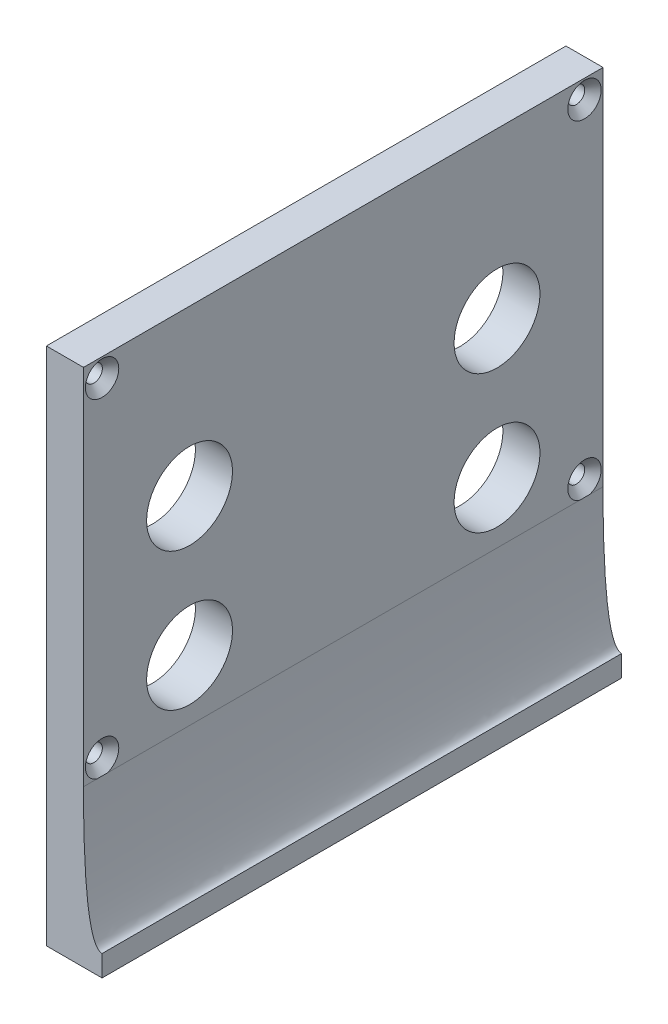
ISO-10303-21;
HEADER;
FILE_DESCRIPTION(('STEP AP214'),'2;1');
FILE_NAME('part.step','',(''),(''),'','','');
FILE_SCHEMA(('AUTOMOTIVE_DESIGN { 1 0 10303 214 1 1 1 1 }'));
ENDSEC;
DATA;
#1=APPLICATION_CONTEXT('core data for automotive mechanical design processes');
#2=APPLICATION_PROTOCOL_DEFINITION('international standard','automotive_design',2000,#1);
#3=PRODUCT_CONTEXT('',#1,'mechanical');
#4=PRODUCT('Part','Part','',(#3));
#5=PRODUCT_RELATED_PRODUCT_CATEGORY('part','',(#4));
#6=PRODUCT_DEFINITION_FORMATION('','',#4);
#7=PRODUCT_DEFINITION_CONTEXT('part definition',#1,'design');
#8=PRODUCT_DEFINITION('design','',#6,#7);
#9=PRODUCT_DEFINITION_SHAPE('','',#8);
#10=(LENGTH_UNIT() NAMED_UNIT(*) SI_UNIT(.MILLI.,.METRE.));
#11=(NAMED_UNIT(*) PLANE_ANGLE_UNIT() SI_UNIT($,.RADIAN.));
#12=(NAMED_UNIT(*) SI_UNIT($,.STERADIAN.) SOLID_ANGLE_UNIT());
#13=UNCERTAINTY_MEASURE_WITH_UNIT(LENGTH_MEASURE(1.E-05),#10,'distance_accuracy_value','');
#14=(GEOMETRIC_REPRESENTATION_CONTEXT(3) GLOBAL_UNCERTAINTY_ASSIGNED_CONTEXT((#13)) GLOBAL_UNIT_ASSIGNED_CONTEXT((#10,
#11,#12)) REPRESENTATION_CONTEXT('',''));
#15=CARTESIAN_POINT('',(0.,0.,0.));
#16=DIRECTION('',(0.,0.,1.));
#17=DIRECTION('',(1.,0.,0.));
#18=AXIS2_PLACEMENT_3D('',#15,#16,#17);
#19=CARTESIAN_POINT('',(-46.838690811529,41.5674555111962,98.));
#20=DIRECTION('',(0.,-1.,0.));
#21=DIRECTION('',(0.,0.,-1.));
#22=AXIS2_PLACEMENT_3D('',#19,#20,#21);
#23=PLANE('',#22);
#24=DIRECTION('',(-1.,0.,0.));
#25=VECTOR('',#24,1.);
#26=CARTESIAN_POINT('',(-46.838690811529,41.5674555111962,0.));
#27=LINE('',#26,#25);
#28=CARTESIAN_POINT('',(-39.838690811529,41.5674555111962,0.));
#29=VERTEX_POINT('',#28);
#30=CARTESIAN_POINT('',(-46.838690811529,41.5674555111962,0.));
#31=VERTEX_POINT('',#30);
#32=EDGE_CURVE('E288',#29,#31,#27,.T.);
#33=ORIENTED_EDGE('',*,*,#32,.T.);
#34=DIRECTION('',(0.,0.,-1.));
#35=VECTOR('',#34,1.);
#36=CARTESIAN_POINT('',(-46.838690811529,41.5674555111962,98.));
#37=LINE('',#36,#35);
#38=CARTESIAN_POINT('',(-46.838690811529,41.5674555111962,98.));
#39=VERTEX_POINT('',#38);
#40=EDGE_CURVE('E13',#39,#31,#37,.T.);
#41=ORIENTED_EDGE('',*,*,#40,.F.);
#42=DIRECTION('',(-1.,0.,0.));
#43=VECTOR('',#42,1.);
#44=CARTESIAN_POINT('',(-46.838690811529,41.5674555111962,98.));
#45=LINE('',#44,#43);
#46=CARTESIAN_POINT('',(-39.838690811529,41.5674555111962,98.));
#47=VERTEX_POINT('',#46);
#48=EDGE_CURVE('E214',#47,#39,#45,.T.);
#49=ORIENTED_EDGE('',*,*,#48,.F.);
#50=DIRECTION('',(0.,0.,-1.));
#51=VECTOR('',#50,1.);
#52=CARTESIAN_POINT('',(-39.838690811529,41.5674555111962,98.));
#53=LINE('',#52,#51);
#54=EDGE_CURVE('E310',#47,#29,#53,.T.);
#55=ORIENTED_EDGE('',*,*,#54,.T.);
#56=EDGE_LOOP('',(#33,#41,#49,#55));
#57=FACE_BOUND('',#56,.T.);
#58=ADVANCED_FACE('F46',(#57),#23,.F.);
#59=CARTESIAN_POINT('',(-46.838690811529,41.5674555111962,98.));
#60=DIRECTION('',(1.,0.,0.));
#61=DIRECTION('',(0.,0.,-1.));
#62=AXIS2_PLACEMENT_3D('',#59,#60,#61);
#63=PLANE('',#62);
#64=DIRECTION('',(0.,0.,1.));
#65=VECTOR('',#64,1.);
#66=CARTESIAN_POINT('',(-46.838690811529,33.0674555111962,39.5));
#67=LINE('',#66,#65);
#68=CARTESIAN_POINT('',(-46.838690811529,33.0674555111962,39.5));
#69=VERTEX_POINT('',#68);
#70=CARTESIAN_POINT('',(-46.838690811529,33.0674555111962,69.));
#71=VERTEX_POINT('',#70);
#72=EDGE_CURVE('E165',#69,#71,#67,.T.);
#73=ORIENTED_EDGE('',*,*,#72,.F.);
#74=DIRECTION('',(0.,-1.,0.));
#75=VECTOR('',#74,1.);
#76=CARTESIAN_POINT('',(-46.838690811529,40.0674555111962,39.5));
#77=LINE('',#76,#75);
#78=CARTESIAN_POINT('',(-46.838690811529,40.0674555111962,39.5));
#79=VERTEX_POINT('',#78);
#80=EDGE_CURVE('E62',#79,#69,#77,.T.);
#81=ORIENTED_EDGE('',*,*,#80,.F.);
#82=DIRECTION('',(0.,0.,-1.));
#83=VECTOR('',#82,1.);
#84=CARTESIAN_POINT('',(-46.838690811529,40.0674555111962,39.5));
#85=LINE('',#84,#83);
#86=CARTESIAN_POINT('',(-46.838690811529,40.0674555111962,69.));
#87=VERTEX_POINT('',#86);
#88=EDGE_CURVE('E156',#87,#79,#85,.T.);
#89=ORIENTED_EDGE('',*,*,#88,.F.);
#90=DIRECTION('',(0.,1.,0.));
#91=VECTOR('',#90,1.);
#92=CARTESIAN_POINT('',(-46.838690811529,40.0674555111962,69.));
#93=LINE('',#92,#91);
#94=EDGE_CURVE('E159',#71,#87,#93,.T.);
#95=ORIENTED_EDGE('',*,*,#94,.F.);
#96=EDGE_LOOP('',(#73,#81,#89,#95));
#97=FACE_BOUND('',#96,.T.);
#98=CARTESIAN_POINT('',(-46.838690811529,38.0674555111962,94.5));
#99=DIRECTION('',(1.,0.,0.));
#100=DIRECTION('',(0.,0.,-1.));
#101=AXIS2_PLACEMENT_3D('',#98,#99,#100);
#102=CIRCLE('',#101,1.59999999999999);
#103=CARTESIAN_POINT('',(-46.838690811529,38.0674555111962,92.9));
#104=VERTEX_POINT('',#103);
#105=EDGE_CURVE('E49',#104,#104,#102,.T.);
#106=ORIENTED_EDGE('',*,*,#105,.T.);
#107=EDGE_LOOP('',(#106));
#108=FACE_BOUND('',#107,.T.);
#109=CARTESIAN_POINT('',(-46.838690811529,-23.9325444888039,94.5));
#110=DIRECTION('',(1.,0.,0.));
#111=DIRECTION('',(0.,0.,-1.));
#112=AXIS2_PLACEMENT_3D('',#109,#110,#111);
#113=CIRCLE('',#112,1.59999999999999);
#114=CARTESIAN_POINT('',(-46.838690811529,-23.9325444888039,92.9));
#115=VERTEX_POINT('',#114);
#116=EDGE_CURVE('E185',#115,#115,#113,.T.);
#117=ORIENTED_EDGE('',*,*,#116,.T.);
#118=EDGE_LOOP('',(#117));
#119=FACE_BOUND('',#118,.T.);
#120=CARTESIAN_POINT('',(-46.838690811529,-23.9325444888039,3.50000000000002));
#121=DIRECTION('',(1.,0.,0.));
#122=DIRECTION('',(0.,0.,-1.));
#123=AXIS2_PLACEMENT_3D('',#120,#121,#122);
#124=CIRCLE('',#123,1.59999999999999);
#125=CARTESIAN_POINT('',(-46.838690811529,-23.9325444888039,1.90000000000003));
#126=VERTEX_POINT('',#125);
#127=EDGE_CURVE('E193',#126,#126,#124,.T.);
#128=ORIENTED_EDGE('',*,*,#127,.T.);
#129=EDGE_LOOP('',(#128));
#130=FACE_BOUND('',#129,.T.);
#131=CARTESIAN_POINT('',(-46.838690811529,38.0674555111962,3.50000000000002));
#132=DIRECTION('',(1.,0.,0.));
#133=DIRECTION('',(0.,0.,-1.));
#134=AXIS2_PLACEMENT_3D('',#131,#132,#133);
#135=CIRCLE('',#134,1.59999999999999);
#136=CARTESIAN_POINT('',(-46.838690811529,38.0674555111962,1.90000000000003));
#137=VERTEX_POINT('',#136);
#138=EDGE_CURVE('E200',#137,#137,#135,.T.);
#139=ORIENTED_EDGE('',*,*,#138,.T.);
#140=EDGE_LOOP('',(#139));
#141=FACE_BOUND('',#140,.T.);
#142=CARTESIAN_POINT('',(-46.838690811529,-15.4325444888038,20.));
#143=DIRECTION('',(-1.,0.,0.));
#144=DIRECTION('',(0.,0.,1.));
#145=AXIS2_PLACEMENT_3D('',#142,#143,#144);
#146=CIRCLE('',#145,8.09999999999999);
#147=CARTESIAN_POINT('',(-46.838690811529,-15.4325444888038,28.1));
#148=VERTEX_POINT('',#147);
#149=EDGE_CURVE('E208',#148,#148,#146,.T.);
#150=ORIENTED_EDGE('',*,*,#149,.F.);
#151=EDGE_LOOP('',(#150));
#152=FACE_BOUND('',#151,.T.);
#153=CARTESIAN_POINT('',(-46.838690811529,10.5674555111962,78.));
#154=DIRECTION('',(-1.,0.,0.));
#155=DIRECTION('',(0.,0.,1.));
#156=AXIS2_PLACEMENT_3D('',#153,#154,#155);
#157=CIRCLE('',#156,8.09999999999999);
#158=CARTESIAN_POINT('',(-46.838690811529,10.5674555111962,86.1));
#159=VERTEX_POINT('',#158);
#160=EDGE_CURVE('E205',#159,#159,#157,.T.);
#161=ORIENTED_EDGE('',*,*,#160,.F.);
#162=EDGE_LOOP('',(#161));
#163=FACE_BOUND('',#162,.T.);
#164=CARTESIAN_POINT('',(-46.838690811529,-15.4325444888038,78.));
#165=DIRECTION('',(-1.,0.,0.));
#166=DIRECTION('',(0.,0.,1.));
#167=AXIS2_PLACEMENT_3D('',#164,#165,#166);
#168=CIRCLE('',#167,8.10000000000001);
#169=CARTESIAN_POINT('',(-46.838690811529,-15.4325444888038,86.1));
#170=VERTEX_POINT('',#169);
#171=EDGE_CURVE('E201',#170,#170,#168,.T.);
#172=ORIENTED_EDGE('',*,*,#171,.F.);
#173=EDGE_LOOP('',(#172));
#174=FACE_BOUND('',#173,.T.);
#175=CARTESIAN_POINT('',(-46.838690811529,10.5674555111962,20.));
#176=DIRECTION('',(-1.,0.,0.));
#177=DIRECTION('',(0.,0.,1.));
#178=AXIS2_PLACEMENT_3D('',#175,#176,#177);
#179=CIRCLE('',#178,8.1);
#180=CARTESIAN_POINT('',(-46.838690811529,10.5674555111962,28.1));
#181=VERTEX_POINT('',#180);
#182=EDGE_CURVE('E204',#181,#181,#179,.T.);
#183=ORIENTED_EDGE('',*,*,#182,.F.);
#184=EDGE_LOOP('',(#183));
#185=FACE_BOUND('',#184,.T.);
#186=DIRECTION('',(0.,-1.,0.));
#187=VECTOR('',#186,1.);
#188=CARTESIAN_POINT('',(-46.838690811529,41.5674555111962,0.));
#189=LINE('',#188,#187);
#190=CARTESIAN_POINT('',(-46.838690811529,-56.4325444888039,0.));
#191=VERTEX_POINT('',#190);
#192=EDGE_CURVE('E279',#31,#191,#189,.T.);
#193=ORIENTED_EDGE('',*,*,#192,.T.);
#194=DIRECTION('',(0.,0.,-1.));
#195=VECTOR('',#194,1.);
#196=CARTESIAN_POINT('',(-46.838690811529,-56.4325444888039,98.));
#197=LINE('',#196,#195);
#198=CARTESIAN_POINT('',(-46.838690811529,-56.4325444888039,98.));
#199=VERTEX_POINT('',#198);
#200=EDGE_CURVE('E54',#199,#191,#197,.T.);
#201=ORIENTED_EDGE('',*,*,#200,.F.);
#202=DIRECTION('',(0.,-1.,0.));
#203=VECTOR('',#202,1.);
#204=CARTESIAN_POINT('',(-46.838690811529,41.5674555111962,98.));
#205=LINE('',#204,#203);
#206=EDGE_CURVE('E217',#39,#199,#205,.T.);
#207=ORIENTED_EDGE('',*,*,#206,.F.);
#208=ORIENTED_EDGE('',*,*,#40,.T.);
#209=EDGE_LOOP('',(#193,#201,#207,#208));
#210=FACE_BOUND('',#209,.T.);
#211=ADVANCED_FACE('F248',(#97,#108,#119,#130,#141,#152,#163,#174,#185,#210),#63,.F.);
#212=CARTESIAN_POINT('',(-46.838690811529,-56.4325444888039,98.));
#213=DIRECTION('',(0.,1.,0.));
#214=DIRECTION('',(0.,0.,1.));
#215=AXIS2_PLACEMENT_3D('',#212,#213,#214);
#216=PLANE('',#215);
#217=DIRECTION('',(1.,0.,0.));
#218=VECTOR('',#217,1.);
#219=CARTESIAN_POINT('',(-46.838690811529,-56.4325444888039,0.));
#220=LINE('',#219,#218);
#221=CARTESIAN_POINT('',(-36.338690811529,-56.4325444888039,0.));
#222=VERTEX_POINT('',#221);
#223=EDGE_CURVE('E287',#191,#222,#220,.T.);
#224=ORIENTED_EDGE('',*,*,#223,.T.);
#225=DIRECTION('',(0.,0.,-1.));
#226=VECTOR('',#225,1.);
#227=CARTESIAN_POINT('',(-36.338690811529,-56.4325444888039,98.));
#228=LINE('',#227,#226);
#229=CARTESIAN_POINT('',(-36.338690811529,-56.4325444888039,98.));
#230=VERTEX_POINT('',#229);
#231=EDGE_CURVE('E292',#230,#222,#228,.T.);
#232=ORIENTED_EDGE('',*,*,#231,.F.);
#233=DIRECTION('',(1.,0.,0.));
#234=VECTOR('',#233,1.);
#235=CARTESIAN_POINT('',(-46.838690811529,-56.4325444888039,98.));
#236=LINE('',#235,#234);
#237=EDGE_CURVE('E220',#199,#230,#236,.T.);
#238=ORIENTED_EDGE('',*,*,#237,.F.);
#239=ORIENTED_EDGE('',*,*,#200,.T.);
#240=EDGE_LOOP('',(#224,#232,#238,#239));
#241=FACE_BOUND('',#240,.T.);
#242=ADVANCED_FACE('F245',(#241),#216,.F.);
#243=CARTESIAN_POINT('',(-36.338690811529,-56.4325444888039,98.));
#244=DIRECTION('',(-1.,0.,0.));
#245=DIRECTION('',(0.,0.,1.));
#246=AXIS2_PLACEMENT_3D('',#243,#244,#245);
#247=PLANE('',#246);
#248=DIRECTION('',(0.,1.,0.));
#249=VECTOR('',#248,1.);
#250=CARTESIAN_POINT('',(-36.338690811529,-56.4325444888039,0.));
#251=LINE('',#250,#249);
#252=CARTESIAN_POINT('',(-36.338690811529,-52.4325444888039,0.));
#253=VERTEX_POINT('',#252);
#254=EDGE_CURVE('E297',#222,#253,#251,.T.);
#255=ORIENTED_EDGE('',*,*,#254,.T.);
#256=DIRECTION('',(0.,0.,-1.));
#257=VECTOR('',#256,1.);
#258=CARTESIAN_POINT('',(-36.338690811529,-52.4325444888039,98.));
#259=LINE('',#258,#257);
#260=CARTESIAN_POINT('',(-36.338690811529,-52.4325444888039,98.));
#261=VERTEX_POINT('',#260);
#262=EDGE_CURVE('E317',#261,#253,#259,.T.);
#263=ORIENTED_EDGE('',*,*,#262,.F.);
#264=DIRECTION('',(0.,1.,0.));
#265=VECTOR('',#264,1.);
#266=CARTESIAN_POINT('',(-36.338690811529,-56.4325444888039,98.));
#267=LINE('',#266,#265);
#268=EDGE_CURVE('E222',#230,#261,#267,.T.);
#269=ORIENTED_EDGE('',*,*,#268,.F.);
#270=ORIENTED_EDGE('',*,*,#231,.T.);
#271=EDGE_LOOP('',(#255,#263,#269,#270));
#272=FACE_BOUND('',#271,.T.);
#273=ADVANCED_FACE('F240',(#272),#247,.F.);
#274=CARTESIAN_POINT('',(-36.338690811529,-52.4325444888039,98.));
#275=CARTESIAN_POINT('',(-39.838690811529,-52.4325444888039,98.));
#276=CARTESIAN_POINT('',(-39.838690811529,-26.9325444888039,98.));
#277=B_SPLINE_CURVE_WITH_KNOTS('',2,(#274,#275,#276),.UNSPECIFIED.,.F.,.F.,(3,3),(0.,1.),.UNSPECIFIED.);
#278=DIRECTION('',(0.,0.,-1.));
#279=VECTOR('',#278,1.);
#280=SURFACE_OF_LINEAR_EXTRUSION('',#277,#279);
#281=CARTESIAN_POINT('',(-36.338690811529,-52.4325444888039,0.));
#282=CARTESIAN_POINT('',(-39.838690811529,-52.4325444888039,0.));
#283=CARTESIAN_POINT('',(-39.838690811529,-26.9325444888039,0.));
#284=B_SPLINE_CURVE_WITH_KNOTS('',2,(#281,#282,#283),.UNSPECIFIED.,.F.,.F.,(3,3),(0.,1.),.UNSPECIFIED.);
#285=CARTESIAN_POINT('',(-39.838690811529,-26.9325444888039,0.));
#286=VERTEX_POINT('',#285);
#287=EDGE_CURVE('E299',#253,#286,#284,.T.);
#288=ORIENTED_EDGE('',*,*,#287,.T.);
#289=DIRECTION('',(0.,0.,-1.));
#290=VECTOR('',#289,1.);
#291=CARTESIAN_POINT('',(-39.838690811529,-26.9325444888039,98.));
#292=LINE('',#291,#290);
#293=CARTESIAN_POINT('',(-39.838690811529,-26.9325444888039,2.5395313643851));
#294=VERTEX_POINT('',#293);
#295=EDGE_CURVE('E313',#294,#286,#292,.T.);
#296=ORIENTED_EDGE('',*,*,#295,.F.);
#297=CARTESIAN_POINT('',(-39.838690811529,-26.9325444888039,4.46046863561494));
#298=VERTEX_POINT('',#297);
#299=EDGE_CURVE('E320',#298,#294,#292,.T.);
#300=ORIENTED_EDGE('',*,*,#299,.F.);
#301=CARTESIAN_POINT('',(-39.838690811529,-26.9325444888039,93.5395313643851));
#302=VERTEX_POINT('',#301);
#303=EDGE_CURVE('E319',#302,#298,#292,.T.);
#304=ORIENTED_EDGE('',*,*,#303,.F.);
#305=CARTESIAN_POINT('',(-39.838690811529,-26.9325444888039,95.4604686356149));
#306=VERTEX_POINT('',#305);
#307=EDGE_CURVE('E318',#306,#302,#292,.T.);
#308=ORIENTED_EDGE('',*,*,#307,.F.);
#309=CARTESIAN_POINT('',(-39.838690811529,-26.9325444888039,98.));
#310=VERTEX_POINT('',#309);
#311=EDGE_CURVE('E314',#310,#306,#292,.T.);
#312=ORIENTED_EDGE('',*,*,#311,.F.);
#313=EDGE_CURVE('E224',#261,#310,#277,.T.);
#314=ORIENTED_EDGE('',*,*,#313,.F.);
#315=ORIENTED_EDGE('',*,*,#262,.T.);
#316=EDGE_LOOP('',(#288,#296,#300,#304,#308,#312,#314,#315));
#317=FACE_BOUND('',#316,.T.);
#318=ADVANCED_FACE('F235',(#317),#280,.F.);
#319=CARTESIAN_POINT('',(-39.838690811529,41.5674555111962,98.));
#320=DIRECTION('',(-1.,0.,0.));
#321=DIRECTION('',(0.,0.,1.));
#322=AXIS2_PLACEMENT_3D('',#319,#320,#321);
#323=PLANE('',#322);
#324=CARTESIAN_POINT('',(-39.838690811529,38.0674555111962,94.5));
#325=DIRECTION('',(1.,0.,0.));
#326=DIRECTION('',(0.,0.,-1.));
#327=AXIS2_PLACEMENT_3D('',#324,#325,#326);
#328=CIRCLE('',#327,3.15);
#329=CARTESIAN_POINT('',(-39.838690811529,38.0674555111962,91.35));
#330=VERTEX_POINT('',#329);
#331=EDGE_CURVE('E171',#330,#330,#328,.T.);
#332=ORIENTED_EDGE('',*,*,#331,.F.);
#333=EDGE_LOOP('',(#332));
#334=FACE_BOUND('',#333,.T.);
#335=CARTESIAN_POINT('',(-39.838690811529,38.0674555111962,3.50000000000002));
#336=DIRECTION('',(1.,0.,0.));
#337=DIRECTION('',(0.,0.,-1.));
#338=AXIS2_PLACEMENT_3D('',#335,#336,#337);
#339=CIRCLE('',#338,3.15);
#340=CARTESIAN_POINT('',(-39.838690811529,38.0674555111962,0.350000000000017));
#341=VERTEX_POINT('',#340);
#342=EDGE_CURVE('E194',#341,#341,#339,.T.);
#343=ORIENTED_EDGE('',*,*,#342,.F.);
#344=EDGE_LOOP('',(#343));
#345=FACE_BOUND('',#344,.T.);
#346=CARTESIAN_POINT('',(-39.838690811529,-15.4325444888038,20.));
#347=DIRECTION('',(-1.,0.,0.));
#348=DIRECTION('',(0.,0.,1.));
#349=AXIS2_PLACEMENT_3D('',#346,#347,#348);
#350=CIRCLE('',#349,8.09999999999999);
#351=CARTESIAN_POINT('',(-39.838690811529,-15.4325444888038,28.1));
#352=VERTEX_POINT('',#351);
#353=EDGE_CURVE('E332',#352,#352,#350,.T.);
#354=ORIENTED_EDGE('',*,*,#353,.T.);
#355=EDGE_LOOP('',(#354));
#356=FACE_BOUND('',#355,.T.);
#357=CARTESIAN_POINT('',(-39.838690811529,10.5674555111962,78.));
#358=DIRECTION('',(-1.,0.,0.));
#359=DIRECTION('',(0.,0.,1.));
#360=AXIS2_PLACEMENT_3D('',#357,#358,#359);
#361=CIRCLE('',#360,8.09999999999999);
#362=CARTESIAN_POINT('',(-39.838690811529,10.5674555111962,86.1));
#363=VERTEX_POINT('',#362);
#364=EDGE_CURVE('E329',#363,#363,#361,.T.);
#365=ORIENTED_EDGE('',*,*,#364,.T.);
#366=EDGE_LOOP('',(#365));
#367=FACE_BOUND('',#366,.T.);
#368=CARTESIAN_POINT('',(-39.838690811529,-15.4325444888038,78.));
#369=DIRECTION('',(-1.,0.,0.));
#370=DIRECTION('',(0.,0.,1.));
#371=AXIS2_PLACEMENT_3D('',#368,#369,#370);
#372=CIRCLE('',#371,8.10000000000001);
#373=CARTESIAN_POINT('',(-39.838690811529,-15.4325444888038,86.1));
#374=VERTEX_POINT('',#373);
#375=EDGE_CURVE('E326',#374,#374,#372,.T.);
#376=ORIENTED_EDGE('',*,*,#375,.T.);
#377=EDGE_LOOP('',(#376));
#378=FACE_BOUND('',#377,.T.);
#379=CARTESIAN_POINT('',(-39.838690811529,10.5674555111962,20.));
#380=DIRECTION('',(-1.,0.,0.));
#381=DIRECTION('',(0.,0.,1.));
#382=AXIS2_PLACEMENT_3D('',#379,#380,#381);
#383=CIRCLE('',#382,8.1);
#384=CARTESIAN_POINT('',(-39.838690811529,10.5674555111962,28.1));
#385=VERTEX_POINT('',#384);
#386=EDGE_CURVE('E213',#385,#385,#383,.T.);
#387=ORIENTED_EDGE('',*,*,#386,.T.);
#388=EDGE_LOOP('',(#387));
#389=FACE_BOUND('',#388,.T.);
#390=ORIENTED_EDGE('',*,*,#311,.T.);
#391=CARTESIAN_POINT('',(-39.838690811529,-23.9325444888039,94.5));
#392=DIRECTION('',(1.,0.,0.));
#393=DIRECTION('',(0.,0.,-1.));
#394=AXIS2_PLACEMENT_3D('',#391,#392,#393);
#395=CIRCLE('',#394,3.15);
#396=EDGE_CURVE('E182',#302,#306,#395,.T.);
#397=ORIENTED_EDGE('',*,*,#396,.F.);
#398=ORIENTED_EDGE('',*,*,#303,.T.);
#399=CARTESIAN_POINT('',(-39.838690811529,-23.9325444888039,3.50000000000002));
#400=DIRECTION('',(1.,0.,0.));
#401=DIRECTION('',(0.,0.,-1.));
#402=AXIS2_PLACEMENT_3D('',#399,#400,#401);
#403=CIRCLE('',#402,3.15);
#404=EDGE_CURVE('E190',#294,#298,#403,.T.);
#405=ORIENTED_EDGE('',*,*,#404,.F.);
#406=ORIENTED_EDGE('',*,*,#295,.T.);
#407=DIRECTION('',(0.,1.,0.));
#408=VECTOR('',#407,1.);
#409=CARTESIAN_POINT('',(-39.838690811529,41.5674555111962,0.));
#410=LINE('',#409,#408);
#411=EDGE_CURVE('E218',#286,#29,#410,.T.);
#412=ORIENTED_EDGE('',*,*,#411,.T.);
#413=ORIENTED_EDGE('',*,*,#54,.F.);
#414=DIRECTION('',(0.,1.,0.));
#415=VECTOR('',#414,1.);
#416=CARTESIAN_POINT('',(-39.838690811529,41.5674555111962,98.));
#417=LINE('',#416,#415);
#418=EDGE_CURVE('E229',#310,#47,#417,.T.);
#419=ORIENTED_EDGE('',*,*,#418,.F.);
#420=EDGE_LOOP('',(#390,#397,#398,#405,#406,#412,#413,#419));
#421=FACE_BOUND('',#420,.T.);
#422=ADVANCED_FACE('F239',(#334,#345,#356,#367,#378,#389,#421),#323,.F.);
#423=CARTESIAN_POINT('',(-38.963690811529,-46.0575444888039,98.));
#424=DIRECTION('',(0.,0.,-1.));
#425=DIRECTION('',(-1.,0.,0.));
#426=AXIS2_PLACEMENT_3D('',#423,#424,#425);
#427=PLANE('',#426);
#428=ORIENTED_EDGE('',*,*,#48,.T.);
#429=ORIENTED_EDGE('',*,*,#206,.T.);
#430=ORIENTED_EDGE('',*,*,#237,.T.);
#431=ORIENTED_EDGE('',*,*,#268,.T.);
#432=ORIENTED_EDGE('',*,*,#313,.T.);
#433=ORIENTED_EDGE('',*,*,#418,.T.);
#434=EDGE_LOOP('',(#428,#429,#430,#431,#432,#433));
#435=FACE_BOUND('',#434,.T.);
#436=ADVANCED_FACE('F357',(#435),#427,.F.);
#437=CARTESIAN_POINT('',(-38.963690811529,-46.0575444888039,0.));
#438=DIRECTION('',(0.,0.,-1.));
#439=DIRECTION('',(-1.,0.,0.));
#440=AXIS2_PLACEMENT_3D('',#437,#438,#439);
#441=PLANE('',#440);
#442=ORIENTED_EDGE('',*,*,#32,.F.);
#443=ORIENTED_EDGE('',*,*,#411,.F.);
#444=ORIENTED_EDGE('',*,*,#287,.F.);
#445=ORIENTED_EDGE('',*,*,#254,.F.);
#446=ORIENTED_EDGE('',*,*,#223,.F.);
#447=ORIENTED_EDGE('',*,*,#192,.F.);
#448=EDGE_LOOP('',(#442,#443,#444,#445,#446,#447));
#449=FACE_BOUND('',#448,.T.);
#450=ADVANCED_FACE('F295',(#449),#441,.T.);
#451=CARTESIAN_POINT('',(-36.338690811529,10.5674555111962,20.));
#452=DIRECTION('',(-1.,0.,0.));
#453=DIRECTION('',(0.,0.,1.));
#454=AXIS2_PLACEMENT_3D('',#451,#452,#453);
#455=CYLINDRICAL_SURFACE('',#454,8.1);
#456=ORIENTED_EDGE('',*,*,#182,.T.);
#457=EDGE_LOOP('',(#456));
#458=FACE_BOUND('',#457,.T.);
#459=ORIENTED_EDGE('',*,*,#386,.F.);
#460=EDGE_LOOP('',(#459));
#461=FACE_BOUND('',#460,.T.);
#462=ADVANCED_FACE('F367',(#458,#461),#455,.F.);
#463=CARTESIAN_POINT('',(-36.338690811529,-15.4325444888038,78.));
#464=DIRECTION('',(-1.,0.,0.));
#465=DIRECTION('',(0.,0.,1.));
#466=AXIS2_PLACEMENT_3D('',#463,#464,#465);
#467=CYLINDRICAL_SURFACE('',#466,8.10000000000001);
#468=ORIENTED_EDGE('',*,*,#171,.T.);
#469=EDGE_LOOP('',(#468));
#470=FACE_BOUND('',#469,.T.);
#471=ORIENTED_EDGE('',*,*,#375,.F.);
#472=EDGE_LOOP('',(#471));
#473=FACE_BOUND('',#472,.T.);
#474=ADVANCED_FACE('F372',(#470,#473),#467,.F.);
#475=CARTESIAN_POINT('',(-36.338690811529,10.5674555111962,78.));
#476=DIRECTION('',(-1.,0.,0.));
#477=DIRECTION('',(0.,0.,1.));
#478=AXIS2_PLACEMENT_3D('',#475,#476,#477);
#479=CYLINDRICAL_SURFACE('',#478,8.09999999999999);
#480=ORIENTED_EDGE('',*,*,#160,.T.);
#481=EDGE_LOOP('',(#480));
#482=FACE_BOUND('',#481,.T.);
#483=ORIENTED_EDGE('',*,*,#364,.F.);
#484=EDGE_LOOP('',(#483));
#485=FACE_BOUND('',#484,.T.);
#486=ADVANCED_FACE('F378',(#482,#485),#479,.F.);
#487=CARTESIAN_POINT('',(-36.338690811529,-15.4325444888038,20.));
#488=DIRECTION('',(-1.,0.,0.));
#489=DIRECTION('',(0.,0.,1.));
#490=AXIS2_PLACEMENT_3D('',#487,#488,#489);
#491=CYLINDRICAL_SURFACE('',#490,8.09999999999999);
#492=ORIENTED_EDGE('',*,*,#149,.T.);
#493=EDGE_LOOP('',(#492));
#494=FACE_BOUND('',#493,.T.);
#495=ORIENTED_EDGE('',*,*,#353,.F.);
#496=EDGE_LOOP('',(#495));
#497=FACE_BOUND('',#496,.T.);
#498=ADVANCED_FACE('F374',(#494,#497),#491,.F.);
#499=CARTESIAN_POINT('',(-39.838690811529,38.0674555111962,3.50000000000002));
#500=DIRECTION('',(1.,0.,0.));
#501=DIRECTION('',(0.,0.,-1.));
#502=AXIS2_PLACEMENT_3D('',#499,#500,#501);
#503=CYLINDRICAL_SURFACE('',#502,1.59999999999999);
#504=CARTESIAN_POINT('',(-41.388690811529,38.0674555111962,3.50000000000002));
#505=DIRECTION('',(1.,0.,0.));
#506=DIRECTION('',(0.,0.,-1.));
#507=AXIS2_PLACEMENT_3D('',#504,#505,#506);
#508=CIRCLE('',#507,1.59999999999999);
#509=CARTESIAN_POINT('',(-41.388690811529,38.0674555111962,1.90000000000003));
#510=VERTEX_POINT('',#509);
#511=EDGE_CURVE('E197',#510,#510,#508,.T.);
#512=ORIENTED_EDGE('',*,*,#511,.T.);
#513=EDGE_LOOP('',(#512));
#514=FACE_BOUND('',#513,.T.);
#515=ORIENTED_EDGE('',*,*,#138,.F.);
#516=EDGE_LOOP('',(#515));
#517=FACE_BOUND('',#516,.T.);
#518=ADVANCED_FACE('F377',(#514,#517),#503,.F.);
#519=CARTESIAN_POINT('',(-39.838690811529,38.0674555111962,3.50000000000002));
#520=DIRECTION('',(1.,0.,0.));
#521=DIRECTION('',(0.,0.,-1.));
#522=AXIS2_PLACEMENT_3D('',#519,#520,#521);
#523=CONICAL_SURFACE('',#522,3.15,0.785398163397453);
#524=ORIENTED_EDGE('',*,*,#511,.F.);
#525=EDGE_LOOP('',(#524));
#526=FACE_BOUND('',#525,.T.);
#527=ORIENTED_EDGE('',*,*,#342,.T.);
#528=EDGE_LOOP('',(#527));
#529=FACE_BOUND('',#528,.T.);
#530=ADVANCED_FACE('F388',(#526,#529),#523,.F.);
#531=CARTESIAN_POINT('',(-39.838690811529,-23.9325444888039,3.50000000000002));
#532=DIRECTION('',(1.,0.,0.));
#533=DIRECTION('',(0.,0.,-1.));
#534=AXIS2_PLACEMENT_3D('',#531,#532,#533);
#535=CYLINDRICAL_SURFACE('',#534,1.59999999999999);
#536=CARTESIAN_POINT('',(-41.388690811529,-23.9325444888039,3.50000000000002));
#537=DIRECTION('',(1.,0.,0.));
#538=DIRECTION('',(0.,0.,-1.));
#539=AXIS2_PLACEMENT_3D('',#536,#537,#538);
#540=CIRCLE('',#539,1.59999999999999);
#541=CARTESIAN_POINT('',(-41.388690811529,-23.9325444888039,1.90000000000003));
#542=VERTEX_POINT('',#541);
#543=EDGE_CURVE('E189',#542,#542,#540,.T.);
#544=ORIENTED_EDGE('',*,*,#543,.T.);
#545=EDGE_LOOP('',(#544));
#546=FACE_BOUND('',#545,.T.);
#547=ORIENTED_EDGE('',*,*,#127,.F.);
#548=EDGE_LOOP('',(#547));
#549=FACE_BOUND('',#548,.T.);
#550=ADVANCED_FACE('F392',(#546,#549),#535,.F.);
#551=CARTESIAN_POINT('',(-39.838690811529,-20.7825444888039,3.50000000000002));
#552=DIRECTION('',(1.,0.,0.));
#553=DIRECTION('',(0.,0.,-1.));
#554=AXIS2_PLACEMENT_3D('',#551,#552,#553);
#555=PLANE('',#554);
#556=ORIENTED_EDGE('',*,*,#299,.T.);
#557=EDGE_CURVE('E186',#298,#294,#403,.T.);
#558=ORIENTED_EDGE('',*,*,#557,.F.);
#559=EDGE_LOOP('',(#556,#558));
#560=FACE_BOUND('',#559,.T.);
#561=ADVANCED_FACE('F394',(#560),#555,.F.);
#562=CARTESIAN_POINT('',(-39.838690811529,-23.9325444888039,3.50000000000002));
#563=DIRECTION('',(1.,0.,0.));
#564=DIRECTION('',(0.,0.,-1.));
#565=AXIS2_PLACEMENT_3D('',#562,#563,#564);
#566=CONICAL_SURFACE('',#565,3.15,0.785398163397453);
#567=ORIENTED_EDGE('',*,*,#543,.F.);
#568=EDGE_LOOP('',(#567));
#569=FACE_BOUND('',#568,.T.);
#570=ORIENTED_EDGE('',*,*,#557,.T.);
#571=ORIENTED_EDGE('',*,*,#404,.T.);
#572=EDGE_LOOP('',(#570,#571));
#573=FACE_BOUND('',#572,.T.);
#574=ADVANCED_FACE('F340',(#569,#573),#566,.F.);
#575=CARTESIAN_POINT('',(-39.838690811529,-23.9325444888039,94.5));
#576=DIRECTION('',(1.,0.,0.));
#577=DIRECTION('',(0.,0.,-1.));
#578=AXIS2_PLACEMENT_3D('',#575,#576,#577);
#579=CYLINDRICAL_SURFACE('',#578,1.59999999999999);
#580=CARTESIAN_POINT('',(-41.388690811529,-23.9325444888039,94.5));
#581=DIRECTION('',(1.,0.,0.));
#582=DIRECTION('',(0.,0.,-1.));
#583=AXIS2_PLACEMENT_3D('',#580,#581,#582);
#584=CIRCLE('',#583,1.59999999999999);
#585=CARTESIAN_POINT('',(-41.388690811529,-23.9325444888039,92.9));
#586=VERTEX_POINT('',#585);
#587=EDGE_CURVE('E181',#586,#586,#584,.T.);
#588=ORIENTED_EDGE('',*,*,#587,.T.);
#589=EDGE_LOOP('',(#588));
#590=FACE_BOUND('',#589,.T.);
#591=ORIENTED_EDGE('',*,*,#116,.F.);
#592=EDGE_LOOP('',(#591));
#593=FACE_BOUND('',#592,.T.);
#594=ADVANCED_FACE('F402',(#590,#593),#579,.F.);
#595=CARTESIAN_POINT('',(-39.838690811529,-20.7825444888039,94.5));
#596=DIRECTION('',(1.,0.,0.));
#597=DIRECTION('',(0.,0.,-1.));
#598=AXIS2_PLACEMENT_3D('',#595,#596,#597);
#599=PLANE('',#598);
#600=ORIENTED_EDGE('',*,*,#307,.T.);
#601=EDGE_CURVE('E69',#306,#302,#395,.T.);
#602=ORIENTED_EDGE('',*,*,#601,.F.);
#603=EDGE_LOOP('',(#600,#602));
#604=FACE_BOUND('',#603,.T.);
#605=ADVANCED_FACE('F347',(#604),#599,.F.);
#606=CARTESIAN_POINT('',(-39.838690811529,-23.9325444888039,94.5));
#607=DIRECTION('',(1.,0.,0.));
#608=DIRECTION('',(0.,0.,-1.));
#609=AXIS2_PLACEMENT_3D('',#606,#607,#608);
#610=CONICAL_SURFACE('',#609,3.15,0.785398163397453);
#611=ORIENTED_EDGE('',*,*,#587,.F.);
#612=EDGE_LOOP('',(#611));
#613=FACE_BOUND('',#612,.T.);
#614=ORIENTED_EDGE('',*,*,#601,.T.);
#615=ORIENTED_EDGE('',*,*,#396,.T.);
#616=EDGE_LOOP('',(#614,#615));
#617=FACE_BOUND('',#616,.T.);
#618=ADVANCED_FACE('F351',(#613,#617),#610,.F.);
#619=CARTESIAN_POINT('',(-39.838690811529,38.0674555111962,94.5));
#620=DIRECTION('',(1.,0.,0.));
#621=DIRECTION('',(0.,0.,-1.));
#622=AXIS2_PLACEMENT_3D('',#619,#620,#621);
#623=CYLINDRICAL_SURFACE('',#622,1.59999999999999);
#624=CARTESIAN_POINT('',(-41.388690811529,38.0674555111962,94.5));
#625=DIRECTION('',(1.,0.,0.));
#626=DIRECTION('',(0.,0.,-1.));
#627=AXIS2_PLACEMENT_3D('',#624,#625,#626);
#628=CIRCLE('',#627,1.59999999999999);
#629=CARTESIAN_POINT('',(-41.388690811529,38.0674555111962,92.9));
#630=VERTEX_POINT('',#629);
#631=EDGE_CURVE('E177',#630,#630,#628,.T.);
#632=ORIENTED_EDGE('',*,*,#631,.T.);
#633=EDGE_LOOP('',(#632));
#634=FACE_BOUND('',#633,.T.);
#635=ORIENTED_EDGE('',*,*,#105,.F.);
#636=EDGE_LOOP('',(#635));
#637=FACE_BOUND('',#636,.T.);
#638=ADVANCED_FACE('F411',(#634,#637),#623,.F.);
#639=CARTESIAN_POINT('',(-39.838690811529,38.0674555111962,94.5));
#640=DIRECTION('',(1.,0.,0.));
#641=DIRECTION('',(0.,0.,-1.));
#642=AXIS2_PLACEMENT_3D('',#639,#640,#641);
#643=CONICAL_SURFACE('',#642,3.15,0.785398163397453);
#644=ORIENTED_EDGE('',*,*,#631,.F.);
#645=EDGE_LOOP('',(#644));
#646=FACE_BOUND('',#645,.T.);
#647=ORIENTED_EDGE('',*,*,#331,.T.);
#648=EDGE_LOOP('',(#647));
#649=FACE_BOUND('',#648,.T.);
#650=ADVANCED_FACE('F415',(#646,#649),#643,.F.);
#651=CARTESIAN_POINT('',(-44.338690811529,40.0674555111962,39.5));
#652=DIRECTION('',(0.,0.,-1.));
#653=DIRECTION('',(-1.,0.,0.));
#654=AXIS2_PLACEMENT_3D('',#651,#652,#653);
#655=PLANE('',#654);
#656=ORIENTED_EDGE('',*,*,#80,.T.);
#657=DIRECTION('',(-1.,0.,0.));
#658=VECTOR('',#657,1.);
#659=CARTESIAN_POINT('',(-44.338690811529,33.0674555111962,39.5));
#660=LINE('',#659,#658);
#661=CARTESIAN_POINT('',(-44.338690811529,33.0674555111962,39.5));
#662=VERTEX_POINT('',#661);
#663=EDGE_CURVE('E134',#662,#69,#660,.T.);
#664=ORIENTED_EDGE('',*,*,#663,.F.);
#665=DIRECTION('',(0.,-1.,0.));
#666=VECTOR('',#665,1.);
#667=CARTESIAN_POINT('',(-44.338690811529,40.0674555111962,39.5));
#668=LINE('',#667,#666);
#669=CARTESIAN_POINT('',(-44.338690811529,40.0674555111962,39.5));
#670=VERTEX_POINT('',#669);
#671=EDGE_CURVE('E138',#670,#662,#668,.T.);
#672=ORIENTED_EDGE('',*,*,#671,.F.);
#673=DIRECTION('',(-1.,0.,0.));
#674=VECTOR('',#673,1.);
#675=CARTESIAN_POINT('',(-44.338690811529,40.0674555111962,39.5));
#676=LINE('',#675,#674);
#677=EDGE_CURVE('E169',#670,#79,#676,.T.);
#678=ORIENTED_EDGE('',*,*,#677,.T.);
#679=EDGE_LOOP('',(#656,#664,#672,#678));
#680=FACE_BOUND('',#679,.T.);
#681=ADVANCED_FACE('F136',(#680),#655,.F.);
#682=CARTESIAN_POINT('',(-44.338690811529,40.0674555111962,39.5));
#683=DIRECTION('',(0.,1.,0.));
#684=DIRECTION('',(0.,0.,1.));
#685=AXIS2_PLACEMENT_3D('',#682,#683,#684);
#686=PLANE('',#685);
#687=ORIENTED_EDGE('',*,*,#88,.T.);
#688=ORIENTED_EDGE('',*,*,#677,.F.);
#689=DIRECTION('',(0.,0.,-1.));
#690=VECTOR('',#689,1.);
#691=CARTESIAN_POINT('',(-44.338690811529,40.0674555111962,39.5));
#692=LINE('',#691,#690);
#693=CARTESIAN_POINT('',(-44.338690811529,40.0674555111962,69.));
#694=VERTEX_POINT('',#693);
#695=EDGE_CURVE('E144',#694,#670,#692,.T.);
#696=ORIENTED_EDGE('',*,*,#695,.F.);
#697=DIRECTION('',(-1.,0.,0.));
#698=VECTOR('',#697,1.);
#699=CARTESIAN_POINT('',(-44.338690811529,40.0674555111962,69.));
#700=LINE('',#699,#698);
#701=EDGE_CURVE('E172',#694,#87,#700,.T.);
#702=ORIENTED_EDGE('',*,*,#701,.T.);
#703=EDGE_LOOP('',(#687,#688,#696,#702));
#704=FACE_BOUND('',#703,.T.);
#705=ADVANCED_FACE('F422',(#704),#686,.F.);
#706=CARTESIAN_POINT('',(-44.338690811529,40.0674555111962,69.));
#707=DIRECTION('',(0.,0.,1.));
#708=DIRECTION('',(1.,0.,0.));
#709=AXIS2_PLACEMENT_3D('',#706,#707,#708);
#710=PLANE('',#709);
#711=ORIENTED_EDGE('',*,*,#94,.T.);
#712=ORIENTED_EDGE('',*,*,#701,.F.);
#713=DIRECTION('',(0.,1.,0.));
#714=VECTOR('',#713,1.);
#715=CARTESIAN_POINT('',(-44.338690811529,40.0674555111962,69.));
#716=LINE('',#715,#714);
#717=CARTESIAN_POINT('',(-44.338690811529,33.0674555111962,69.));
#718=VERTEX_POINT('',#717);
#719=EDGE_CURVE('E152',#718,#694,#716,.T.);
#720=ORIENTED_EDGE('',*,*,#719,.F.);
#721=DIRECTION('',(-1.,0.,0.));
#722=VECTOR('',#721,1.);
#723=CARTESIAN_POINT('',(-44.338690811529,33.0674555111962,69.));
#724=LINE('',#723,#722);
#725=EDGE_CURVE('E143',#718,#71,#724,.T.);
#726=ORIENTED_EDGE('',*,*,#725,.T.);
#727=EDGE_LOOP('',(#711,#712,#720,#726));
#728=FACE_BOUND('',#727,.T.);
#729=ADVANCED_FACE('F425',(#728),#710,.F.);
#730=CARTESIAN_POINT('',(-44.338690811529,33.0674555111962,39.5));
#731=DIRECTION('',(0.,-1.,0.));
#732=DIRECTION('',(0.,0.,-1.));
#733=AXIS2_PLACEMENT_3D('',#730,#731,#732);
#734=PLANE('',#733);
#735=ORIENTED_EDGE('',*,*,#72,.T.);
#736=ORIENTED_EDGE('',*,*,#725,.F.);
#737=DIRECTION('',(0.,0.,1.));
#738=VECTOR('',#737,1.);
#739=CARTESIAN_POINT('',(-44.338690811529,33.0674555111962,39.5));
#740=LINE('',#739,#738);
#741=EDGE_CURVE('E147',#662,#718,#740,.T.);
#742=ORIENTED_EDGE('',*,*,#741,.F.);
#743=ORIENTED_EDGE('',*,*,#663,.T.);
#744=EDGE_LOOP('',(#735,#736,#742,#743));
#745=FACE_BOUND('',#744,.T.);
#746=ADVANCED_FACE('F148',(#745),#734,.F.);
#747=CARTESIAN_POINT('',(-44.338690811529,0.,0.));
#748=DIRECTION('',(-1.,0.,0.));
#749=DIRECTION('',(0.,0.,1.));
#750=AXIS2_PLACEMENT_3D('',#747,#748,#749);
#751=PLANE('',#750);
#752=ORIENTED_EDGE('',*,*,#671,.T.);
#753=ORIENTED_EDGE('',*,*,#741,.T.);
#754=ORIENTED_EDGE('',*,*,#719,.T.);
#755=ORIENTED_EDGE('',*,*,#695,.T.);
#756=EDGE_LOOP('',(#752,#753,#754,#755));
#757=FACE_BOUND('',#756,.T.);
#758=ADVANCED_FACE('F154',(#757),#751,.T.);
#759=CLOSED_SHELL('',(#58,#211,#242,#273,#318,#422,#436,#450,#462,#474,#486,#498,#518,#530,#550,
#561,#574,#594,#605,#618,#638,#650,#681,#705,#729,#746,#758));
#760=MANIFOLD_SOLID_BREP('B2',#759);
#761=ADVANCED_BREP_SHAPE_REPRESENTATION('',(#18,#760),#14);
#762=SHAPE_DEFINITION_REPRESENTATION(#9,#761);
ENDSEC;
END-ISO-10303-21;
